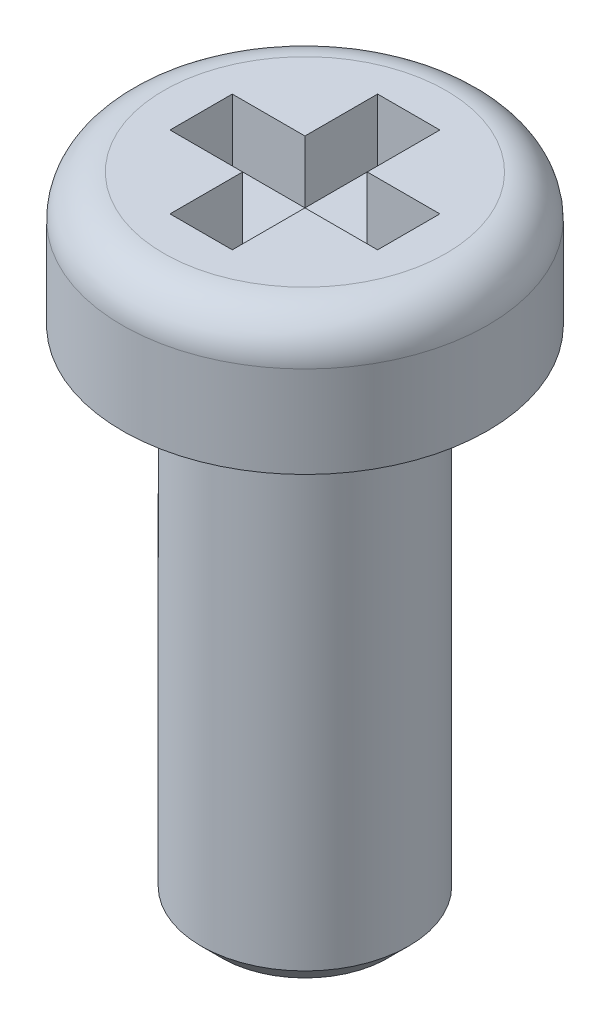
ISO-10303-21;
HEADER;
FILE_DESCRIPTION(('STEP AP214'),'2;1');
FILE_NAME('part.step','',(''),(''),'','','');
FILE_SCHEMA(('AUTOMOTIVE_DESIGN { 1 0 10303 214 1 1 1 1 }'));
ENDSEC;
DATA;
#1=APPLICATION_CONTEXT('core data for automotive mechanical design processes');
#2=APPLICATION_PROTOCOL_DEFINITION('international standard','automotive_design',2000,#1);
#3=PRODUCT_CONTEXT('',#1,'mechanical');
#4=PRODUCT('Part','Part','',(#3));
#5=PRODUCT_RELATED_PRODUCT_CATEGORY('part','',(#4));
#6=PRODUCT_DEFINITION_FORMATION('','',#4);
#7=PRODUCT_DEFINITION_CONTEXT('part definition',#1,'design');
#8=PRODUCT_DEFINITION('design','',#6,#7);
#9=PRODUCT_DEFINITION_SHAPE('','',#8);
#10=(LENGTH_UNIT() NAMED_UNIT(*) SI_UNIT(.MILLI.,.METRE.));
#11=(NAMED_UNIT(*) PLANE_ANGLE_UNIT() SI_UNIT($,.RADIAN.));
#12=(NAMED_UNIT(*) SI_UNIT($,.STERADIAN.) SOLID_ANGLE_UNIT());
#13=UNCERTAINTY_MEASURE_WITH_UNIT(LENGTH_MEASURE(1.E-05),#10,'distance_accuracy_value','');
#14=(GEOMETRIC_REPRESENTATION_CONTEXT(3) GLOBAL_UNCERTAINTY_ASSIGNED_CONTEXT((#13)) GLOBAL_UNIT_ASSIGNED_CONTEXT((#10,
#11,#12)) REPRESENTATION_CONTEXT('',''));
#15=CARTESIAN_POINT('',(0.,0.,0.));
#16=DIRECTION('',(0.,0.,1.));
#17=DIRECTION('',(1.,0.,0.));
#18=AXIS2_PLACEMENT_3D('',#15,#16,#17);
#19=CARTESIAN_POINT('',(0.,0.,0.));
#20=DIRECTION('',(0.,-1.,0.));
#21=DIRECTION('',(1.,0.,0.));
#22=AXIS2_PLACEMENT_3D('',#19,#20,#21);
#23=PLANE('',#22);
#24=DIRECTION('',(-1.,0.,0.));
#25=VECTOR('',#24,1.);
#26=CARTESIAN_POINT('',(-0.375,0.,-1.25));
#27=LINE('',#26,#25);
#28=CARTESIAN_POINT('',(0.375000000000003,0.,-1.25));
#29=VERTEX_POINT('',#28);
#30=CARTESIAN_POINT('',(-0.375,0.,-1.25));
#31=VERTEX_POINT('',#30);
#32=EDGE_CURVE('E166',#29,#31,#27,.T.);
#33=ORIENTED_EDGE('',*,*,#32,.F.);
#34=DIRECTION('',(0.,0.,-1.));
#35=VECTOR('',#34,1.);
#36=CARTESIAN_POINT('',(0.375,0.,-0.375));
#37=LINE('',#36,#35);
#38=CARTESIAN_POINT('',(0.375,0.,-0.375));
#39=VERTEX_POINT('',#38);
#40=EDGE_CURVE('E56',#39,#29,#37,.T.);
#41=ORIENTED_EDGE('',*,*,#40,.F.);
#42=DIRECTION('',(-1.,0.,0.));
#43=VECTOR('',#42,1.);
#44=CARTESIAN_POINT('',(0.375,0.,-0.375));
#45=LINE('',#44,#43);
#46=CARTESIAN_POINT('',(1.25,0.,-0.375));
#47=VERTEX_POINT('',#46);
#48=EDGE_CURVE('E193',#47,#39,#45,.T.);
#49=ORIENTED_EDGE('',*,*,#48,.F.);
#50=DIRECTION('',(0.,0.,-1.));
#51=VECTOR('',#50,1.);
#52=CARTESIAN_POINT('',(1.25,0.,0.375));
#53=LINE('',#52,#51);
#54=CARTESIAN_POINT('',(1.25,0.,0.375));
#55=VERTEX_POINT('',#54);
#56=EDGE_CURVE('E191',#55,#47,#53,.T.);
#57=ORIENTED_EDGE('',*,*,#56,.F.);
#58=DIRECTION('',(1.,0.,0.));
#59=VECTOR('',#58,1.);
#60=CARTESIAN_POINT('',(0.375,0.,0.375));
#61=LINE('',#60,#59);
#62=CARTESIAN_POINT('',(0.375,0.,0.375));
#63=VERTEX_POINT('',#62);
#64=EDGE_CURVE('E140',#63,#55,#61,.T.);
#65=ORIENTED_EDGE('',*,*,#64,.F.);
#66=DIRECTION('',(0.,0.,-1.));
#67=VECTOR('',#66,1.);
#68=CARTESIAN_POINT('',(0.375,0.,1.25));
#69=LINE('',#68,#67);
#70=CARTESIAN_POINT('',(0.375,0.,1.25));
#71=VERTEX_POINT('',#70);
#72=EDGE_CURVE('E187',#71,#63,#69,.T.);
#73=ORIENTED_EDGE('',*,*,#72,.F.);
#74=DIRECTION('',(1.,0.,0.));
#75=VECTOR('',#74,1.);
#76=CARTESIAN_POINT('',(-0.375,0.,1.25));
#77=LINE('',#76,#75);
#78=CARTESIAN_POINT('',(-0.375,0.,1.25));
#79=VERTEX_POINT('',#78);
#80=EDGE_CURVE('E184',#79,#71,#77,.T.);
#81=ORIENTED_EDGE('',*,*,#80,.F.);
#82=DIRECTION('',(0.,0.,1.));
#83=VECTOR('',#82,1.);
#84=CARTESIAN_POINT('',(-0.375,0.,1.25));
#85=LINE('',#84,#83);
#86=CARTESIAN_POINT('',(-0.375,0.,0.375));
#87=VERTEX_POINT('',#86);
#88=EDGE_CURVE('E181',#87,#79,#85,.T.);
#89=ORIENTED_EDGE('',*,*,#88,.F.);
#90=DIRECTION('',(1.,0.,0.));
#91=VECTOR('',#90,1.);
#92=CARTESIAN_POINT('',(-1.25,0.,0.375));
#93=LINE('',#92,#91);
#94=CARTESIAN_POINT('',(-1.25,0.,0.375));
#95=VERTEX_POINT('',#94);
#96=EDGE_CURVE('E178',#95,#87,#93,.T.);
#97=ORIENTED_EDGE('',*,*,#96,.F.);
#98=DIRECTION('',(0.,0.,1.));
#99=VECTOR('',#98,1.);
#100=CARTESIAN_POINT('',(-1.25,0.,0.375));
#101=LINE('',#100,#99);
#102=CARTESIAN_POINT('',(-1.25,0.,-0.375));
#103=VERTEX_POINT('',#102);
#104=EDGE_CURVE('E175',#103,#95,#101,.T.);
#105=ORIENTED_EDGE('',*,*,#104,.F.);
#106=DIRECTION('',(-1.,0.,0.));
#107=VECTOR('',#106,1.);
#108=CARTESIAN_POINT('',(-1.25,0.,-0.375));
#109=LINE('',#108,#107);
#110=CARTESIAN_POINT('',(-0.375,0.,-0.375));
#111=VERTEX_POINT('',#110);
#112=EDGE_CURVE('E172',#111,#103,#109,.T.);
#113=ORIENTED_EDGE('',*,*,#112,.F.);
#114=DIRECTION('',(0.,0.,1.));
#115=VECTOR('',#114,1.);
#116=CARTESIAN_POINT('',(-0.375,0.,-0.375));
#117=LINE('',#116,#115);
#118=EDGE_CURVE('E169',#31,#111,#117,.T.);
#119=ORIENTED_EDGE('',*,*,#118,.F.);
#120=EDGE_LOOP('',(#33,#41,#49,#57,#65,#73,#81,#89,#97,#105,#113,#119));
#121=FACE_BOUND('',#120,.T.);
#122=CARTESIAN_POINT('',(0.,0.,0.));
#123=DIRECTION('',(0.,-1.,0.));
#124=DIRECTION('',(1.,0.,0.));
#125=AXIS2_PLACEMENT_3D('',#122,#123,#124);
#126=CIRCLE('',#125,1.7);
#127=CARTESIAN_POINT('',(1.7,0.,0.));
#128=VERTEX_POINT('',#127);
#129=EDGE_CURVE('E11',#128,#128,#126,.F.);
#130=ORIENTED_EDGE('',*,*,#129,.T.);
#131=EDGE_LOOP('',(#130));
#132=FACE_BOUND('',#131,.T.);
#133=ADVANCED_FACE('F41',(#121,#132),#23,.F.);
#134=CARTESIAN_POINT('',(4.73673366025713E-13,-138.087166902337,0.));
#135=DIRECTION('',(0.,-1.,0.));
#136=DIRECTION('',(1.,0.,0.));
#137=AXIS2_PLACEMENT_3D('',#134,#135,#136);
#138=CYLINDRICAL_SURFACE('',#137,2.2);
#139=CARTESIAN_POINT('',(0.,-0.5,0.));
#140=DIRECTION('',(0.,-1.,0.));
#141=DIRECTION('',(1.,0.,0.));
#142=AXIS2_PLACEMENT_3D('',#139,#140,#141);
#143=CIRCLE('',#142,2.2);
#144=CARTESIAN_POINT('',(2.20000000000001,-0.499999999999993,0.));
#145=VERTEX_POINT('',#144);
#146=EDGE_CURVE('E49',#145,#145,#143,.T.);
#147=ORIENTED_EDGE('',*,*,#146,.T.);
#148=EDGE_LOOP('',(#147));
#149=FACE_BOUND('',#148,.T.);
#150=CARTESIAN_POINT('',(0.,-1.59999999999999,0.));
#151=DIRECTION('',(0.,-1.,0.));
#152=DIRECTION('',(1.,0.,0.));
#153=AXIS2_PLACEMENT_3D('',#150,#151,#152);
#154=CIRCLE('',#153,2.20000000000001);
#155=CARTESIAN_POINT('',(2.20000000000001,-1.59999999999998,0.));
#156=VERTEX_POINT('',#155);
#157=EDGE_CURVE('E217',#156,#156,#154,.T.);
#158=ORIENTED_EDGE('',*,*,#157,.F.);
#159=EDGE_LOOP('',(#158));
#160=FACE_BOUND('',#159,.T.);
#161=ADVANCED_FACE('F228',(#149,#160),#138,.T.);
#162=CARTESIAN_POINT('',(-2.2,-1.6,0.));
#163=DIRECTION('',(0.,1.,0.));
#164=DIRECTION('',(-1.,0.,0.));
#165=AXIS2_PLACEMENT_3D('',#162,#163,#164);
#166=PLANE('',#165);
#167=CARTESIAN_POINT('',(0.,-1.59999999999999,0.));
#168=DIRECTION('',(0.,-1.,0.));
#169=DIRECTION('',(1.,0.,0.));
#170=AXIS2_PLACEMENT_3D('',#167,#168,#169);
#171=CIRCLE('',#170,1.25000000000001);
#172=CARTESIAN_POINT('',(1.25000000000001,-1.59999999999999,0.));
#173=VERTEX_POINT('',#172);
#174=EDGE_CURVE('E197',#173,#173,#171,.T.);
#175=ORIENTED_EDGE('',*,*,#174,.F.);
#176=EDGE_LOOP('',(#175));
#177=FACE_BOUND('',#176,.T.);
#178=ORIENTED_EDGE('',*,*,#157,.T.);
#179=EDGE_LOOP('',(#178));
#180=FACE_BOUND('',#179,.T.);
#181=ADVANCED_FACE('F250',(#177,#180),#166,.F.);
#182=CARTESIAN_POINT('',(4.73673366025713E-13,-138.087166902337,0.));
#183=DIRECTION('',(0.,-1.,0.));
#184=DIRECTION('',(1.,0.,0.));
#185=AXIS2_PLACEMENT_3D('',#182,#183,#184);
#186=CYLINDRICAL_SURFACE('',#185,1.25000000000002);
#187=CARTESIAN_POINT('',(0.,-7.45000000000004,0.));
#188=DIRECTION('',(0.,1.,0.));
#189=DIRECTION('',(-1.,0.,0.));
#190=AXIS2_PLACEMENT_3D('',#187,#188,#189);
#191=CIRCLE('',#190,1.25000000000002);
#192=CARTESIAN_POINT('',(-1.24999999999999,-7.45000000000004,0.));
#193=VERTEX_POINT('',#192);
#194=EDGE_CURVE('E223',#193,#193,#191,.T.);
#195=ORIENTED_EDGE('',*,*,#194,.T.);
#196=EDGE_LOOP('',(#195));
#197=FACE_BOUND('',#196,.T.);
#198=ORIENTED_EDGE('',*,*,#174,.T.);
#199=EDGE_LOOP('',(#198));
#200=FACE_BOUND('',#199,.T.);
#201=ADVANCED_FACE('F260',(#197,#200),#186,.T.);
#202=CARTESIAN_POINT('',(-1.25,-7.7,0.));
#203=DIRECTION('',(0.,1.,0.));
#204=DIRECTION('',(-1.,0.,0.));
#205=AXIS2_PLACEMENT_3D('',#202,#203,#204);
#206=PLANE('',#205);
#207=CARTESIAN_POINT('',(0.,-7.7,0.));
#208=DIRECTION('',(0.,1.,0.));
#209=DIRECTION('',(-1.,0.,0.));
#210=AXIS2_PLACEMENT_3D('',#207,#208,#209);
#211=CIRCLE('',#210,1.00000000000007);
#212=CARTESIAN_POINT('',(-1.00000000000005,-7.7,0.));
#213=VERTEX_POINT('',#212);
#214=EDGE_CURVE('E220',#213,#213,#211,.F.);
#215=ORIENTED_EDGE('',*,*,#214,.T.);
#216=EDGE_LOOP('',(#215));
#217=FACE_BOUND('',#216,.T.);
#218=ADVANCED_FACE('F243',(#217),#206,.F.);
#219=CARTESIAN_POINT('',(0.,-7.70000000000001,0.));
#220=DIRECTION('',(0.,1.,0.));
#221=DIRECTION('',(-1.,0.,0.));
#222=AXIS2_PLACEMENT_3D('',#219,#220,#221);
#223=CONICAL_SURFACE('',#222,1.00000000000006,0.785398163397418);
#224=ORIENTED_EDGE('',*,*,#194,.F.);
#225=EDGE_LOOP('',(#224));
#226=FACE_BOUND('',#225,.T.);
#227=ORIENTED_EDGE('',*,*,#214,.F.);
#228=EDGE_LOOP('',(#227));
#229=FACE_BOUND('',#228,.T.);
#230=ADVANCED_FACE('F233',(#226,#229),#223,.T.);
#231=CARTESIAN_POINT('',(0.,-0.5,0.));
#232=DIRECTION('',(0.,-1.,0.));
#233=DIRECTION('',(1.,0.,0.));
#234=AXIS2_PLACEMENT_3D('',#231,#232,#233);
#235=TOROIDAL_SURFACE('',#234,1.7,0.5);
#236=ORIENTED_EDGE('',*,*,#129,.F.);
#237=EDGE_LOOP('',(#236));
#238=FACE_BOUND('',#237,.T.);
#239=ORIENTED_EDGE('',*,*,#146,.F.);
#240=EDGE_LOOP('',(#239));
#241=FACE_BOUND('',#240,.T.);
#242=ADVANCED_FACE('F43',(#238,#241),#235,.T.);
#243=CARTESIAN_POINT('',(0.375000000000003,-0.749999999999999,-0.375));
#244=DIRECTION('',(1.,0.,0.));
#245=DIRECTION('',(0.,1.,0.));
#246=AXIS2_PLACEMENT_3D('',#243,#244,#245);
#247=PLANE('',#246);
#248=ORIENTED_EDGE('',*,*,#40,.T.);
#249=DIRECTION('',(0.,1.,0.));
#250=VECTOR('',#249,1.);
#251=CARTESIAN_POINT('',(0.375000000000003,-0.749999999999999,-1.25));
#252=LINE('',#251,#250);
#253=CARTESIAN_POINT('',(0.375000000000003,-0.749999999999999,-1.25));
#254=VERTEX_POINT('',#253);
#255=EDGE_CURVE('E104',#254,#29,#252,.T.);
#256=ORIENTED_EDGE('',*,*,#255,.F.);
#257=DIRECTION('',(0.,0.,-1.));
#258=VECTOR('',#257,1.);
#259=CARTESIAN_POINT('',(0.375000000000003,-0.749999999999999,-0.375));
#260=LINE('',#259,#258);
#261=CARTESIAN_POINT('',(0.375000000000003,-0.749999999999999,-0.375));
#262=VERTEX_POINT('',#261);
#263=EDGE_CURVE('E195',#262,#254,#260,.T.);
#264=ORIENTED_EDGE('',*,*,#263,.F.);
#265=DIRECTION('',(0.,1.,0.));
#266=VECTOR('',#265,1.);
#267=CARTESIAN_POINT('',(0.375000000000003,-0.749999999999999,-0.375));
#268=LINE('',#267,#266);
#269=EDGE_CURVE('E64',#262,#39,#268,.T.);
#270=ORIENTED_EDGE('',*,*,#269,.T.);
#271=EDGE_LOOP('',(#248,#256,#264,#270));
#272=FACE_BOUND('',#271,.T.);
#273=ADVANCED_FACE('F232',(#272),#247,.F.);
#274=CARTESIAN_POINT('',(0.375000000000003,-0.749999999999999,-0.375));
#275=DIRECTION('',(0.,0.,-1.));
#276=DIRECTION('',(-1.,0.,0.));
#277=AXIS2_PLACEMENT_3D('',#274,#275,#276);
#278=PLANE('',#277);
#279=ORIENTED_EDGE('',*,*,#48,.T.);
#280=ORIENTED_EDGE('',*,*,#269,.F.);
#281=DIRECTION('',(-1.,0.,0.));
#282=VECTOR('',#281,1.);
#283=CARTESIAN_POINT('',(0.375000000000003,-0.749999999999999,-0.375));
#284=LINE('',#283,#282);
#285=CARTESIAN_POINT('',(1.25,-0.749999999999996,-0.375));
#286=VERTEX_POINT('',#285);
#287=EDGE_CURVE('E152',#286,#262,#284,.T.);
#288=ORIENTED_EDGE('',*,*,#287,.F.);
#289=DIRECTION('',(0.,1.,0.));
#290=VECTOR('',#289,1.);
#291=CARTESIAN_POINT('',(1.25,-0.749999999999996,-0.375));
#292=LINE('',#291,#290);
#293=EDGE_CURVE('E144',#286,#47,#292,.T.);
#294=ORIENTED_EDGE('',*,*,#293,.T.);
#295=EDGE_LOOP('',(#279,#280,#288,#294));
#296=FACE_BOUND('',#295,.T.);
#297=ADVANCED_FACE('F240',(#296),#278,.F.);
#298=CARTESIAN_POINT('',(1.25,-0.749999999999996,0.375));
#299=DIRECTION('',(1.,0.,0.));
#300=DIRECTION('',(0.,1.,0.));
#301=AXIS2_PLACEMENT_3D('',#298,#299,#300);
#302=PLANE('',#301);
#303=ORIENTED_EDGE('',*,*,#56,.T.);
#304=ORIENTED_EDGE('',*,*,#293,.F.);
#305=DIRECTION('',(0.,0.,-1.));
#306=VECTOR('',#305,1.);
#307=CARTESIAN_POINT('',(1.25,-0.749999999999996,0.375));
#308=LINE('',#307,#306);
#309=CARTESIAN_POINT('',(1.25,-0.749999999999996,0.375));
#310=VERTEX_POINT('',#309);
#311=EDGE_CURVE('E148',#310,#286,#308,.T.);
#312=ORIENTED_EDGE('',*,*,#311,.F.);
#313=DIRECTION('',(0.,1.,0.));
#314=VECTOR('',#313,1.);
#315=CARTESIAN_POINT('',(1.25,-0.749999999999996,0.375));
#316=LINE('',#315,#314);
#317=EDGE_CURVE('E133',#310,#55,#316,.T.);
#318=ORIENTED_EDGE('',*,*,#317,.T.);
#319=EDGE_LOOP('',(#303,#304,#312,#318));
#320=FACE_BOUND('',#319,.T.);
#321=ADVANCED_FACE('F149',(#320),#302,.F.);
#322=CARTESIAN_POINT('',(0.375000000000002,-0.749999999999999,0.375));
#323=DIRECTION('',(0.,0.,1.));
#324=DIRECTION('',(1.,0.,0.));
#325=AXIS2_PLACEMENT_3D('',#322,#323,#324);
#326=PLANE('',#325);
#327=ORIENTED_EDGE('',*,*,#64,.T.);
#328=ORIENTED_EDGE('',*,*,#317,.F.);
#329=DIRECTION('',(1.,0.,0.));
#330=VECTOR('',#329,1.);
#331=CARTESIAN_POINT('',(0.375000000000002,-0.749999999999999,0.375));
#332=LINE('',#331,#330);
#333=CARTESIAN_POINT('',(0.375000000000002,-0.749999999999999,0.375));
#334=VERTEX_POINT('',#333);
#335=EDGE_CURVE('E137',#334,#310,#332,.T.);
#336=ORIENTED_EDGE('',*,*,#335,.F.);
#337=DIRECTION('',(0.,1.,0.));
#338=VECTOR('',#337,1.);
#339=CARTESIAN_POINT('',(0.375000000000002,-0.749999999999999,0.375));
#340=LINE('',#339,#338);
#341=EDGE_CURVE('E145',#334,#63,#340,.T.);
#342=ORIENTED_EDGE('',*,*,#341,.T.);
#343=EDGE_LOOP('',(#327,#328,#336,#342));
#344=FACE_BOUND('',#343,.T.);
#345=ADVANCED_FACE('F135',(#344),#326,.F.);
#346=CARTESIAN_POINT('',(0.375000000000003,-0.749999999999999,1.25));
#347=DIRECTION('',(1.,0.,0.));
#348=DIRECTION('',(0.,1.,0.));
#349=AXIS2_PLACEMENT_3D('',#346,#347,#348);
#350=PLANE('',#349);
#351=ORIENTED_EDGE('',*,*,#72,.T.);
#352=ORIENTED_EDGE('',*,*,#341,.F.);
#353=DIRECTION('',(0.,0.,-1.));
#354=VECTOR('',#353,1.);
#355=CARTESIAN_POINT('',(0.375000000000003,-0.749999999999999,1.25));
#356=LINE('',#355,#354);
#357=CARTESIAN_POINT('',(0.375000000000003,-0.749999999999999,1.25));
#358=VERTEX_POINT('',#357);
#359=EDGE_CURVE('E158',#358,#334,#356,.T.);
#360=ORIENTED_EDGE('',*,*,#359,.F.);
#361=DIRECTION('',(0.,1.,0.));
#362=VECTOR('',#361,1.);
#363=CARTESIAN_POINT('',(0.375000000000003,-0.749999999999999,1.25));
#364=LINE('',#363,#362);
#365=EDGE_CURVE('E200',#358,#71,#364,.T.);
#366=ORIENTED_EDGE('',*,*,#365,.T.);
#367=EDGE_LOOP('',(#351,#352,#360,#366));
#368=FACE_BOUND('',#367,.T.);
#369=ADVANCED_FACE('F295',(#368),#350,.F.);
#370=CARTESIAN_POINT('',(-0.374999999999997,-0.750000000000001,1.25));
#371=DIRECTION('',(0.,0.,1.));
#372=DIRECTION('',(1.,0.,0.));
#373=AXIS2_PLACEMENT_3D('',#370,#371,#372);
#374=PLANE('',#373);
#375=ORIENTED_EDGE('',*,*,#80,.T.);
#376=ORIENTED_EDGE('',*,*,#365,.F.);
#377=DIRECTION('',(1.,0.,0.));
#378=VECTOR('',#377,1.);
#379=CARTESIAN_POINT('',(-0.374999999999997,-0.750000000000001,1.25));
#380=LINE('',#379,#378);
#381=CARTESIAN_POINT('',(-0.374999999999997,-0.750000000000001,1.25));
#382=VERTEX_POINT('',#381);
#383=EDGE_CURVE('E160',#382,#358,#380,.T.);
#384=ORIENTED_EDGE('',*,*,#383,.F.);
#385=DIRECTION('',(0.,1.,0.));
#386=VECTOR('',#385,1.);
#387=CARTESIAN_POINT('',(-0.374999999999997,-0.750000000000001,1.25));
#388=LINE('',#387,#386);
#389=EDGE_CURVE('E202',#382,#79,#388,.T.);
#390=ORIENTED_EDGE('',*,*,#389,.T.);
#391=EDGE_LOOP('',(#375,#376,#384,#390));
#392=FACE_BOUND('',#391,.T.);
#393=ADVANCED_FACE('F291',(#392),#374,.F.);
#394=CARTESIAN_POINT('',(-0.374999999999997,-0.750000000000001,1.25));
#395=DIRECTION('',(-1.,0.,0.));
#396=DIRECTION('',(0.,-1.,0.));
#397=AXIS2_PLACEMENT_3D('',#394,#395,#396);
#398=PLANE('',#397);
#399=ORIENTED_EDGE('',*,*,#88,.T.);
#400=ORIENTED_EDGE('',*,*,#389,.F.);
#401=DIRECTION('',(0.,0.,1.));
#402=VECTOR('',#401,1.);
#403=CARTESIAN_POINT('',(-0.374999999999997,-0.750000000000001,1.25));
#404=LINE('',#403,#402);
#405=CARTESIAN_POINT('',(-0.374999999999998,-0.750000000000001,0.375));
#406=VERTEX_POINT('',#405);
#407=EDGE_CURVE('E444',#406,#382,#404,.T.);
#408=ORIENTED_EDGE('',*,*,#407,.F.);
#409=DIRECTION('',(0.,1.,0.));
#410=VECTOR('',#409,1.);
#411=CARTESIAN_POINT('',(-0.374999999999998,-0.750000000000001,0.375));
#412=LINE('',#411,#410);
#413=EDGE_CURVE('E204',#406,#87,#412,.T.);
#414=ORIENTED_EDGE('',*,*,#413,.T.);
#415=EDGE_LOOP('',(#399,#400,#408,#414));
#416=FACE_BOUND('',#415,.T.);
#417=ADVANCED_FACE('F287',(#416),#398,.F.);
#418=CARTESIAN_POINT('',(-1.25,-0.750000000000004,0.375));
#419=DIRECTION('',(0.,0.,1.));
#420=DIRECTION('',(1.,0.,0.));
#421=AXIS2_PLACEMENT_3D('',#418,#419,#420);
#422=PLANE('',#421);
#423=ORIENTED_EDGE('',*,*,#96,.T.);
#424=ORIENTED_EDGE('',*,*,#413,.F.);
#425=DIRECTION('',(1.,0.,0.));
#426=VECTOR('',#425,1.);
#427=CARTESIAN_POINT('',(-1.25,-0.750000000000004,0.375));
#428=LINE('',#427,#426);
#429=CARTESIAN_POINT('',(-1.25,-0.750000000000004,0.375));
#430=VERTEX_POINT('',#429);
#431=EDGE_CURVE('E441',#430,#406,#428,.T.);
#432=ORIENTED_EDGE('',*,*,#431,.F.);
#433=DIRECTION('',(0.,1.,0.));
#434=VECTOR('',#433,1.);
#435=CARTESIAN_POINT('',(-1.25,-0.750000000000004,0.375));
#436=LINE('',#435,#434);
#437=EDGE_CURVE('E206',#430,#95,#436,.T.);
#438=ORIENTED_EDGE('',*,*,#437,.T.);
#439=EDGE_LOOP('',(#423,#424,#432,#438));
#440=FACE_BOUND('',#439,.T.);
#441=ADVANCED_FACE('F283',(#440),#422,.F.);
#442=CARTESIAN_POINT('',(-1.25,-0.750000000000004,0.375));
#443=DIRECTION('',(-1.,0.,0.));
#444=DIRECTION('',(0.,-1.,0.));
#445=AXIS2_PLACEMENT_3D('',#442,#443,#444);
#446=PLANE('',#445);
#447=ORIENTED_EDGE('',*,*,#104,.T.);
#448=ORIENTED_EDGE('',*,*,#437,.F.);
#449=DIRECTION('',(0.,0.,1.));
#450=VECTOR('',#449,1.);
#451=CARTESIAN_POINT('',(-1.25,-0.750000000000004,0.375));
#452=LINE('',#451,#450);
#453=CARTESIAN_POINT('',(-1.25,-0.750000000000004,-0.375));
#454=VERTEX_POINT('',#453);
#455=EDGE_CURVE('E438',#454,#430,#452,.T.);
#456=ORIENTED_EDGE('',*,*,#455,.F.);
#457=DIRECTION('',(0.,1.,0.));
#458=VECTOR('',#457,1.);
#459=CARTESIAN_POINT('',(-1.25,-0.750000000000004,-0.375));
#460=LINE('',#459,#458);
#461=EDGE_CURVE('E208',#454,#103,#460,.T.);
#462=ORIENTED_EDGE('',*,*,#461,.T.);
#463=EDGE_LOOP('',(#447,#448,#456,#462));
#464=FACE_BOUND('',#463,.T.);
#465=ADVANCED_FACE('F279',(#464),#446,.F.);
#466=CARTESIAN_POINT('',(-1.25,-0.750000000000004,-0.375));
#467=DIRECTION('',(0.,0.,-1.));
#468=DIRECTION('',(-1.,0.,0.));
#469=AXIS2_PLACEMENT_3D('',#466,#467,#468);
#470=PLANE('',#469);
#471=ORIENTED_EDGE('',*,*,#112,.T.);
#472=ORIENTED_EDGE('',*,*,#461,.F.);
#473=DIRECTION('',(-1.,0.,0.));
#474=VECTOR('',#473,1.);
#475=CARTESIAN_POINT('',(-1.25,-0.750000000000004,-0.375));
#476=LINE('',#475,#474);
#477=CARTESIAN_POINT('',(-0.374999999999997,-0.750000000000001,-0.375));
#478=VERTEX_POINT('',#477);
#479=EDGE_CURVE('E435',#478,#454,#476,.T.);
#480=ORIENTED_EDGE('',*,*,#479,.F.);
#481=DIRECTION('',(0.,1.,0.));
#482=VECTOR('',#481,1.);
#483=CARTESIAN_POINT('',(-0.374999999999997,-0.750000000000001,-0.375));
#484=LINE('',#483,#482);
#485=EDGE_CURVE('E210',#478,#111,#484,.T.);
#486=ORIENTED_EDGE('',*,*,#485,.T.);
#487=EDGE_LOOP('',(#471,#472,#480,#486));
#488=FACE_BOUND('',#487,.T.);
#489=ADVANCED_FACE('F275',(#488),#470,.F.);
#490=CARTESIAN_POINT('',(-0.374999999999997,-0.750000000000001,-0.375));
#491=DIRECTION('',(-1.,0.,0.));
#492=DIRECTION('',(0.,-1.,0.));
#493=AXIS2_PLACEMENT_3D('',#490,#491,#492);
#494=PLANE('',#493);
#495=ORIENTED_EDGE('',*,*,#118,.T.);
#496=ORIENTED_EDGE('',*,*,#485,.F.);
#497=DIRECTION('',(0.,0.,1.));
#498=VECTOR('',#497,1.);
#499=CARTESIAN_POINT('',(-0.374999999999997,-0.750000000000001,-0.375));
#500=LINE('',#499,#498);
#501=CARTESIAN_POINT('',(-0.374999999999997,-0.750000000000001,-1.25));
#502=VERTEX_POINT('',#501);
#503=EDGE_CURVE('E430',#502,#478,#500,.T.);
#504=ORIENTED_EDGE('',*,*,#503,.F.);
#505=DIRECTION('',(0.,1.,0.));
#506=VECTOR('',#505,1.);
#507=CARTESIAN_POINT('',(-0.374999999999997,-0.750000000000001,-1.25));
#508=LINE('',#507,#506);
#509=EDGE_CURVE('E212',#502,#31,#508,.T.);
#510=ORIENTED_EDGE('',*,*,#509,.T.);
#511=EDGE_LOOP('',(#495,#496,#504,#510));
#512=FACE_BOUND('',#511,.T.);
#513=ADVANCED_FACE('F271',(#512),#494,.F.);
#514=CARTESIAN_POINT('',(-0.374999999999997,-0.750000000000001,-1.25));
#515=DIRECTION('',(0.,0.,-1.));
#516=DIRECTION('',(-1.,0.,0.));
#517=AXIS2_PLACEMENT_3D('',#514,#515,#516);
#518=PLANE('',#517);
#519=ORIENTED_EDGE('',*,*,#32,.T.);
#520=ORIENTED_EDGE('',*,*,#509,.F.);
#521=DIRECTION('',(-1.,0.,0.));
#522=VECTOR('',#521,1.);
#523=CARTESIAN_POINT('',(-0.374999999999997,-0.750000000000001,-1.25));
#524=LINE('',#523,#522);
#525=EDGE_CURVE('E428',#254,#502,#524,.T.);
#526=ORIENTED_EDGE('',*,*,#525,.F.);
#527=ORIENTED_EDGE('',*,*,#255,.T.);
#528=EDGE_LOOP('',(#519,#520,#526,#527));
#529=FACE_BOUND('',#528,.T.);
#530=ADVANCED_FACE('F268',(#529),#518,.F.);
#531=CARTESIAN_POINT('',(0.,-0.75,0.));
#532=DIRECTION('',(0.,-1.,0.));
#533=DIRECTION('',(1.,0.,0.));
#534=AXIS2_PLACEMENT_3D('',#531,#532,#533);
#535=PLANE('',#534);
#536=ORIENTED_EDGE('',*,*,#263,.T.);
#537=ORIENTED_EDGE('',*,*,#525,.T.);
#538=ORIENTED_EDGE('',*,*,#503,.T.);
#539=ORIENTED_EDGE('',*,*,#479,.T.);
#540=ORIENTED_EDGE('',*,*,#455,.T.);
#541=ORIENTED_EDGE('',*,*,#431,.T.);
#542=ORIENTED_EDGE('',*,*,#407,.T.);
#543=ORIENTED_EDGE('',*,*,#383,.T.);
#544=ORIENTED_EDGE('',*,*,#359,.T.);
#545=ORIENTED_EDGE('',*,*,#335,.T.);
#546=ORIENTED_EDGE('',*,*,#311,.T.);
#547=ORIENTED_EDGE('',*,*,#287,.T.);
#548=EDGE_LOOP('',(#536,#537,#538,#539,#540,#541,#542,#543,#544,#545,#546,#547));
#549=FACE_BOUND('',#548,.T.);
#550=ADVANCED_FACE('F155',(#549),#535,.F.);
#551=CLOSED_SHELL('',(#133,#161,#181,#201,#218,#230,#242,#273,#297,#321,#345,#369,#393,#417,
#441,#465,#489,#513,#530,#550));
#552=MANIFOLD_SOLID_BREP('B2',#551);
#553=ADVANCED_BREP_SHAPE_REPRESENTATION('',(#18,#552),#14);
#554=SHAPE_DEFINITION_REPRESENTATION(#9,#553);
ENDSEC;
END-ISO-10303-21;
